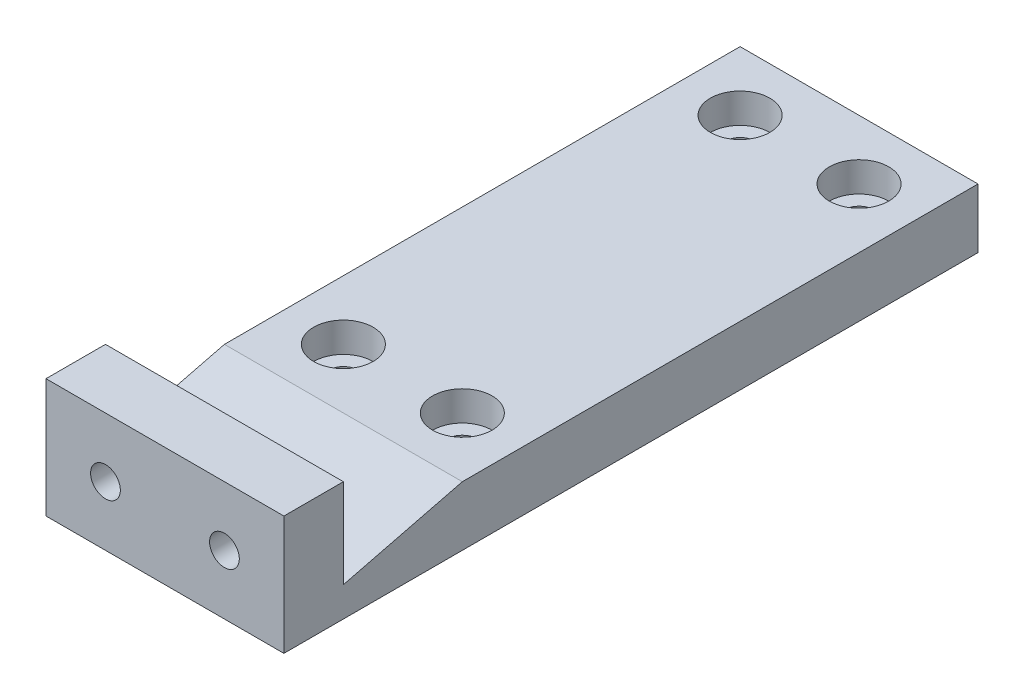
ISO-10303-21;
HEADER;
FILE_DESCRIPTION(('STEP AP214'),'2;1');
FILE_NAME('part.step','',(''),(''),'','','');
FILE_SCHEMA(('AUTOMOTIVE_DESIGN { 1 0 10303 214 1 1 1 1 }'));
ENDSEC;
DATA;
#1=APPLICATION_CONTEXT('core data for automotive mechanical design processes');
#2=APPLICATION_PROTOCOL_DEFINITION('international standard','automotive_design',2000,#1);
#3=PRODUCT_CONTEXT('',#1,'mechanical');
#4=PRODUCT('Part','Part','',(#3));
#5=PRODUCT_RELATED_PRODUCT_CATEGORY('part','',(#4));
#6=PRODUCT_DEFINITION_FORMATION('','',#4);
#7=PRODUCT_DEFINITION_CONTEXT('part definition',#1,'design');
#8=PRODUCT_DEFINITION('design','',#6,#7);
#9=PRODUCT_DEFINITION_SHAPE('','',#8);
#10=(LENGTH_UNIT() NAMED_UNIT(*) SI_UNIT(.MILLI.,.METRE.));
#11=(NAMED_UNIT(*) PLANE_ANGLE_UNIT() SI_UNIT($,.RADIAN.));
#12=(NAMED_UNIT(*) SI_UNIT($,.STERADIAN.) SOLID_ANGLE_UNIT());
#13=UNCERTAINTY_MEASURE_WITH_UNIT(LENGTH_MEASURE(1.E-05),#10,'distance_accuracy_value','');
#14=(GEOMETRIC_REPRESENTATION_CONTEXT(3) GLOBAL_UNCERTAINTY_ASSIGNED_CONTEXT((#13)) GLOBAL_UNIT_ASSIGNED_CONTEXT((#10,
#11,#12)) REPRESENTATION_CONTEXT('',''));
#15=CARTESIAN_POINT('',(0.,0.,0.));
#16=DIRECTION('',(0.,0.,1.));
#17=DIRECTION('',(1.,0.,0.));
#18=AXIS2_PLACEMENT_3D('',#15,#16,#17);
#19=CARTESIAN_POINT('',(-10.,10.,58.35));
#20=DIRECTION('',(0.,0.,-1.));
#21=DIRECTION('',(-1.,0.,0.));
#22=AXIS2_PLACEMENT_3D('',#19,#20,#21);
#23=CYLINDRICAL_SURFACE('',#22,2.5);
#24=CARTESIAN_POINT('',(-10.,10.,58.35));
#25=DIRECTION('',(0.,0.,-1.));
#26=DIRECTION('',(-1.,0.,0.));
#27=AXIS2_PLACEMENT_3D('',#24,#25,#26);
#28=CIRCLE('',#27,2.5);
#29=CARTESIAN_POINT('',(-12.5,10.,58.35));
#30=VERTEX_POINT('',#29);
#31=EDGE_CURVE('E201',#30,#30,#28,.T.);
#32=ORIENTED_EDGE('',*,*,#31,.F.);
#33=EDGE_LOOP('',(#32));
#34=FACE_BOUND('',#33,.T.);
#35=CARTESIAN_POINT('',(-10.,10.,53.35));
#36=DIRECTION('',(0.,0.,-1.));
#37=DIRECTION('',(-1.,0.,0.));
#38=AXIS2_PLACEMENT_3D('',#35,#36,#37);
#39=CIRCLE('',#38,2.5);
#40=CARTESIAN_POINT('',(-12.5,10.,53.35));
#41=VERTEX_POINT('',#40);
#42=EDGE_CURVE('E49',#41,#41,#39,.F.);
#43=ORIENTED_EDGE('',*,*,#42,.F.);
#44=EDGE_LOOP('',(#43));
#45=FACE_BOUND('',#44,.T.);
#46=ADVANCED_FACE('F45',(#34,#45),#23,.F.);
#47=CARTESIAN_POINT('',(10.,10.,58.35));
#48=DIRECTION('',(0.,0.,-1.));
#49=DIRECTION('',(-1.,0.,0.));
#50=AXIS2_PLACEMENT_3D('',#47,#48,#49);
#51=CYLINDRICAL_SURFACE('',#50,2.5);
#52=CARTESIAN_POINT('',(10.,10.,58.35));
#53=DIRECTION('',(0.,0.,-1.));
#54=DIRECTION('',(-1.,0.,0.));
#55=AXIS2_PLACEMENT_3D('',#52,#53,#54);
#56=CIRCLE('',#55,2.5);
#57=CARTESIAN_POINT('',(7.5,10.,58.35));
#58=VERTEX_POINT('',#57);
#59=EDGE_CURVE('E124',#58,#58,#56,.T.);
#60=ORIENTED_EDGE('',*,*,#59,.F.);
#61=EDGE_LOOP('',(#60));
#62=FACE_BOUND('',#61,.T.);
#63=CARTESIAN_POINT('',(10.,10.,53.35));
#64=DIRECTION('',(0.,0.,-1.));
#65=DIRECTION('',(-1.,0.,0.));
#66=AXIS2_PLACEMENT_3D('',#63,#64,#65);
#67=CIRCLE('',#66,2.5);
#68=CARTESIAN_POINT('',(7.5,10.,53.35));
#69=VERTEX_POINT('',#68);
#70=EDGE_CURVE('E192',#69,#69,#67,.F.);
#71=ORIENTED_EDGE('',*,*,#70,.F.);
#72=EDGE_LOOP('',(#71));
#73=FACE_BOUND('',#72,.T.);
#74=ADVANCED_FACE('F332',(#62,#73),#51,.F.);
#75=CARTESIAN_POINT('',(-10.,0.,-48.35));
#76=DIRECTION('',(0.,1.,0.));
#77=DIRECTION('',(0.,0.,1.));
#78=AXIS2_PLACEMENT_3D('',#75,#76,#77);
#79=CYLINDRICAL_SURFACE('',#78,2.5);
#80=CARTESIAN_POINT('',(-10.,0.,-48.35));
#81=DIRECTION('',(0.,1.,0.));
#82=DIRECTION('',(0.,0.,1.));
#83=AXIS2_PLACEMENT_3D('',#80,#81,#82);
#84=CIRCLE('',#83,2.5);
#85=CARTESIAN_POINT('',(-10.,0.,-45.85));
#86=VERTEX_POINT('',#85);
#87=EDGE_CURVE('E266',#86,#86,#84,.T.);
#88=ORIENTED_EDGE('',*,*,#87,.F.);
#89=EDGE_LOOP('',(#88));
#90=FACE_BOUND('',#89,.T.);
#91=CARTESIAN_POINT('',(-10.,5.,-48.35));
#92=DIRECTION('',(0.,1.,0.));
#93=DIRECTION('',(0.,0.,1.));
#94=AXIS2_PLACEMENT_3D('',#91,#92,#93);
#95=CIRCLE('',#94,2.5);
#96=CARTESIAN_POINT('',(-10.,5.,-45.85));
#97=VERTEX_POINT('',#96);
#98=EDGE_CURVE('E188',#97,#97,#95,.F.);
#99=ORIENTED_EDGE('',*,*,#98,.F.);
#100=EDGE_LOOP('',(#99));
#101=FACE_BOUND('',#100,.T.);
#102=ADVANCED_FACE('F338',(#90,#101),#79,.F.);
#103=CARTESIAN_POINT('',(10.,0.,-48.35));
#104=DIRECTION('',(0.,1.,0.));
#105=DIRECTION('',(0.,0.,1.));
#106=AXIS2_PLACEMENT_3D('',#103,#104,#105);
#107=CYLINDRICAL_SURFACE('',#106,2.5);
#108=CARTESIAN_POINT('',(10.,0.,-48.35));
#109=DIRECTION('',(0.,1.,0.));
#110=DIRECTION('',(0.,0.,1.));
#111=AXIS2_PLACEMENT_3D('',#108,#109,#110);
#112=CIRCLE('',#111,2.5);
#113=CARTESIAN_POINT('',(10.,0.,-45.85));
#114=VERTEX_POINT('',#113);
#115=EDGE_CURVE('E262',#114,#114,#112,.T.);
#116=ORIENTED_EDGE('',*,*,#115,.F.);
#117=EDGE_LOOP('',(#116));
#118=FACE_BOUND('',#117,.T.);
#119=CARTESIAN_POINT('',(10.,5.,-48.35));
#120=DIRECTION('',(0.,1.,0.));
#121=DIRECTION('',(0.,0.,1.));
#122=AXIS2_PLACEMENT_3D('',#119,#120,#121);
#123=CIRCLE('',#122,2.5);
#124=CARTESIAN_POINT('',(10.,5.,-45.85));
#125=VERTEX_POINT('',#124);
#126=EDGE_CURVE('E184',#125,#125,#123,.F.);
#127=ORIENTED_EDGE('',*,*,#126,.F.);
#128=EDGE_LOOP('',(#127));
#129=FACE_BOUND('',#128,.T.);
#130=ADVANCED_FACE('F379',(#118,#129),#107,.F.);
#131=CARTESIAN_POINT('',(10.,0.,18.35));
#132=DIRECTION('',(0.,1.,0.));
#133=DIRECTION('',(0.,0.,1.));
#134=AXIS2_PLACEMENT_3D('',#131,#132,#133);
#135=CYLINDRICAL_SURFACE('',#134,2.5);
#136=CARTESIAN_POINT('',(10.,0.,18.35));
#137=DIRECTION('',(0.,1.,0.));
#138=DIRECTION('',(0.,0.,1.));
#139=AXIS2_PLACEMENT_3D('',#136,#137,#138);
#140=CIRCLE('',#139,2.5);
#141=CARTESIAN_POINT('',(10.,0.,20.85));
#142=VERTEX_POINT('',#141);
#143=EDGE_CURVE('E267',#142,#142,#140,.T.);
#144=ORIENTED_EDGE('',*,*,#143,.F.);
#145=EDGE_LOOP('',(#144));
#146=FACE_BOUND('',#145,.T.);
#147=CARTESIAN_POINT('',(10.,5.,18.35));
#148=DIRECTION('',(0.,1.,0.));
#149=DIRECTION('',(0.,0.,1.));
#150=AXIS2_PLACEMENT_3D('',#147,#148,#149);
#151=CIRCLE('',#150,2.5);
#152=CARTESIAN_POINT('',(10.,5.,20.85));
#153=VERTEX_POINT('',#152);
#154=EDGE_CURVE('E179',#153,#153,#151,.F.);
#155=ORIENTED_EDGE('',*,*,#154,.F.);
#156=EDGE_LOOP('',(#155));
#157=FACE_BOUND('',#156,.T.);
#158=ADVANCED_FACE('F328',(#146,#157),#135,.F.);
#159=CARTESIAN_POINT('',(-10.,0.,18.35));
#160=DIRECTION('',(0.,1.,0.));
#161=DIRECTION('',(0.,0.,1.));
#162=AXIS2_PLACEMENT_3D('',#159,#160,#161);
#163=CYLINDRICAL_SURFACE('',#162,2.5);
#164=CARTESIAN_POINT('',(-10.,0.,18.35));
#165=DIRECTION('',(0.,1.,0.));
#166=DIRECTION('',(0.,0.,1.));
#167=AXIS2_PLACEMENT_3D('',#164,#165,#166);
#168=CIRCLE('',#167,2.5);
#169=CARTESIAN_POINT('',(-10.,0.,20.85));
#170=VERTEX_POINT('',#169);
#171=EDGE_CURVE('E191',#170,#170,#168,.T.);
#172=ORIENTED_EDGE('',*,*,#171,.F.);
#173=EDGE_LOOP('',(#172));
#174=FACE_BOUND('',#173,.T.);
#175=CARTESIAN_POINT('',(-10.,5.,18.35));
#176=DIRECTION('',(0.,1.,0.));
#177=DIRECTION('',(0.,0.,1.));
#178=AXIS2_PLACEMENT_3D('',#175,#176,#177);
#179=CIRCLE('',#178,2.5);
#180=CARTESIAN_POINT('',(-10.,5.,20.85));
#181=VERTEX_POINT('',#180);
#182=EDGE_CURVE('E175',#181,#181,#179,.F.);
#183=ORIENTED_EDGE('',*,*,#182,.F.);
#184=EDGE_LOOP('',(#183));
#185=FACE_BOUND('',#184,.T.);
#186=ADVANCED_FACE('F320',(#174,#185),#163,.F.);
#187=CARTESIAN_POINT('',(-20.,10.,58.35));
#188=DIRECTION('',(1.,0.,0.));
#189=DIRECTION('',(0.,0.,-1.));
#190=AXIS2_PLACEMENT_3D('',#187,#188,#189);
#191=PLANE('',#190);
#192=DIRECTION('',(0.,-1.,0.));
#193=VECTOR('',#192,1.);
#194=CARTESIAN_POINT('',(-20.,20.,48.35));
#195=LINE('',#194,#193);
#196=CARTESIAN_POINT('',(-20.,20.,48.35));
#197=VERTEX_POINT('',#196);
#198=CARTESIAN_POINT('',(-20.,5.,48.35));
#199=VERTEX_POINT('',#198);
#200=EDGE_CURVE('E291',#197,#199,#195,.T.);
#201=ORIENTED_EDGE('',*,*,#200,.T.);
#202=DIRECTION('',(0.,0.242535625036333,-0.970142500145332));
#203=VECTOR('',#202,1.);
#204=CARTESIAN_POINT('',(-20.,2.94117647058823,56.5852941176471));
#205=LINE('',#204,#203);
#206=CARTESIAN_POINT('',(-20.,10.,28.35));
#207=VERTEX_POINT('',#206);
#208=EDGE_CURVE('E222',#199,#207,#205,.T.);
#209=ORIENTED_EDGE('',*,*,#208,.T.);
#210=DIRECTION('',(0.,0.,1.));
#211=VECTOR('',#210,1.);
#212=CARTESIAN_POINT('',(-20.,10.,58.35));
#213=LINE('',#212,#211);
#214=CARTESIAN_POINT('',(-20.,10.,-58.35));
#215=VERTEX_POINT('',#214);
#216=EDGE_CURVE('E133',#215,#207,#213,.T.);
#217=ORIENTED_EDGE('',*,*,#216,.F.);
#218=DIRECTION('',(0.,-1.,0.));
#219=VECTOR('',#218,1.);
#220=CARTESIAN_POINT('',(-20.,10.,-58.35));
#221=LINE('',#220,#219);
#222=CARTESIAN_POINT('',(-20.,0.,-58.35));
#223=VERTEX_POINT('',#222);
#224=EDGE_CURVE('E146',#215,#223,#221,.T.);
#225=ORIENTED_EDGE('',*,*,#224,.T.);
#226=DIRECTION('',(0.,0.,1.));
#227=VECTOR('',#226,1.);
#228=CARTESIAN_POINT('',(-20.,0.,58.35));
#229=LINE('',#228,#227);
#230=CARTESIAN_POINT('',(-20.,0.,58.35));
#231=VERTEX_POINT('',#230);
#232=EDGE_CURVE('E154',#223,#231,#229,.T.);
#233=ORIENTED_EDGE('',*,*,#232,.T.);
#234=DIRECTION('',(0.,-1.,0.));
#235=VECTOR('',#234,1.);
#236=CARTESIAN_POINT('',(-20.,10.,58.35));
#237=LINE('',#236,#235);
#238=CARTESIAN_POINT('',(-20.,20.,58.35));
#239=VERTEX_POINT('',#238);
#240=EDGE_CURVE('E11',#239,#231,#237,.T.);
#241=ORIENTED_EDGE('',*,*,#240,.F.);
#242=DIRECTION('',(0.,0.,1.));
#243=VECTOR('',#242,1.);
#244=CARTESIAN_POINT('',(-20.,20.,48.35));
#245=LINE('',#244,#243);
#246=EDGE_CURVE('E277',#197,#239,#245,.T.);
#247=ORIENTED_EDGE('',*,*,#246,.F.);
#248=EDGE_LOOP('',(#201,#209,#217,#225,#233,#241,#247));
#249=FACE_BOUND('',#248,.T.);
#250=ADVANCED_FACE('F47',(#249),#191,.F.);
#251=CARTESIAN_POINT('',(20.,10.,58.35));
#252=DIRECTION('',(0.,0.,-1.));
#253=DIRECTION('',(-1.,0.,0.));
#254=AXIS2_PLACEMENT_3D('',#251,#252,#253);
#255=PLANE('',#254);
#256=ORIENTED_EDGE('',*,*,#59,.T.);
#257=EDGE_LOOP('',(#256));
#258=FACE_BOUND('',#257,.T.);
#259=ORIENTED_EDGE('',*,*,#31,.T.);
#260=EDGE_LOOP('',(#259));
#261=FACE_BOUND('',#260,.T.);
#262=DIRECTION('',(1.,0.,0.));
#263=VECTOR('',#262,1.);
#264=CARTESIAN_POINT('',(20.,0.,58.35));
#265=LINE('',#264,#263);
#266=CARTESIAN_POINT('',(20.,0.,58.35));
#267=VERTEX_POINT('',#266);
#268=EDGE_CURVE('E158',#231,#267,#265,.T.);
#269=ORIENTED_EDGE('',*,*,#268,.T.);
#270=DIRECTION('',(0.,-1.,0.));
#271=VECTOR('',#270,1.);
#272=CARTESIAN_POINT('',(20.,10.,58.35));
#273=LINE('',#272,#271);
#274=CARTESIAN_POINT('',(20.,20.,58.35));
#275=VERTEX_POINT('',#274);
#276=EDGE_CURVE('E55',#275,#267,#273,.T.);
#277=ORIENTED_EDGE('',*,*,#276,.F.);
#278=DIRECTION('',(1.,0.,0.));
#279=VECTOR('',#278,1.);
#280=CARTESIAN_POINT('',(-20.,20.,58.35));
#281=LINE('',#280,#279);
#282=EDGE_CURVE('E281',#239,#275,#281,.T.);
#283=ORIENTED_EDGE('',*,*,#282,.F.);
#284=ORIENTED_EDGE('',*,*,#240,.T.);
#285=EDGE_LOOP('',(#269,#277,#283,#284));
#286=FACE_BOUND('',#285,.T.);
#287=ADVANCED_FACE('F306',(#258,#261,#286),#255,.F.);
#288=CARTESIAN_POINT('',(20.,10.,58.35));
#289=DIRECTION('',(-1.,0.,0.));
#290=DIRECTION('',(0.,0.,1.));
#291=AXIS2_PLACEMENT_3D('',#288,#289,#290);
#292=PLANE('',#291);
#293=DIRECTION('',(0.,-0.242535625036333,0.970142500145332));
#294=VECTOR('',#293,1.);
#295=CARTESIAN_POINT('',(20.,10.,28.35));
#296=LINE('',#295,#294);
#297=CARTESIAN_POINT('',(20.,10.,28.35));
#298=VERTEX_POINT('',#297);
#299=CARTESIAN_POINT('',(20.,5.,48.35));
#300=VERTEX_POINT('',#299);
#301=EDGE_CURVE('E111',#298,#300,#296,.T.);
#302=ORIENTED_EDGE('',*,*,#301,.T.);
#303=DIRECTION('',(0.,-1.,0.));
#304=VECTOR('',#303,1.);
#305=CARTESIAN_POINT('',(20.,20.,48.35));
#306=LINE('',#305,#304);
#307=CARTESIAN_POINT('',(20.,20.,48.35));
#308=VERTEX_POINT('',#307);
#309=EDGE_CURVE('E159',#308,#300,#306,.T.);
#310=ORIENTED_EDGE('',*,*,#309,.F.);
#311=DIRECTION('',(0.,0.,-1.));
#312=VECTOR('',#311,1.);
#313=CARTESIAN_POINT('',(20.,20.,48.35));
#314=LINE('',#313,#312);
#315=EDGE_CURVE('E285',#275,#308,#314,.T.);
#316=ORIENTED_EDGE('',*,*,#315,.F.);
#317=ORIENTED_EDGE('',*,*,#276,.T.);
#318=DIRECTION('',(0.,0.,-1.));
#319=VECTOR('',#318,1.);
#320=CARTESIAN_POINT('',(20.,0.,58.35));
#321=LINE('',#320,#319);
#322=CARTESIAN_POINT('',(20.,0.,-58.35));
#323=VERTEX_POINT('',#322);
#324=EDGE_CURVE('E162',#267,#323,#321,.T.);
#325=ORIENTED_EDGE('',*,*,#324,.T.);
#326=DIRECTION('',(0.,-1.,0.));
#327=VECTOR('',#326,1.);
#328=CARTESIAN_POINT('',(20.,10.,-58.35));
#329=LINE('',#328,#327);
#330=CARTESIAN_POINT('',(20.,10.,-58.35));
#331=VERTEX_POINT('',#330);
#332=EDGE_CURVE('E139',#331,#323,#329,.T.);
#333=ORIENTED_EDGE('',*,*,#332,.F.);
#334=DIRECTION('',(0.,0.,-1.));
#335=VECTOR('',#334,1.);
#336=CARTESIAN_POINT('',(20.,10.,58.35));
#337=LINE('',#336,#335);
#338=EDGE_CURVE('E130',#298,#331,#337,.T.);
#339=ORIENTED_EDGE('',*,*,#338,.F.);
#340=EDGE_LOOP('',(#302,#310,#316,#317,#325,#333,#339));
#341=FACE_BOUND('',#340,.T.);
#342=ADVANCED_FACE('F137',(#341),#292,.F.);
#343=CARTESIAN_POINT('',(20.,10.,-58.35));
#344=DIRECTION('',(0.,0.,1.));
#345=DIRECTION('',(1.,0.,0.));
#346=AXIS2_PLACEMENT_3D('',#343,#344,#345);
#347=PLANE('',#346);
#348=DIRECTION('',(-1.,0.,0.));
#349=VECTOR('',#348,1.);
#350=CARTESIAN_POINT('',(20.,0.,-58.35));
#351=LINE('',#350,#349);
#352=EDGE_CURVE('E148',#323,#223,#351,.T.);
#353=ORIENTED_EDGE('',*,*,#352,.T.);
#354=ORIENTED_EDGE('',*,*,#224,.F.);
#355=DIRECTION('',(-1.,0.,0.));
#356=VECTOR('',#355,1.);
#357=CARTESIAN_POINT('',(20.,10.,-58.35));
#358=LINE('',#357,#356);
#359=EDGE_CURVE('E142',#331,#215,#358,.T.);
#360=ORIENTED_EDGE('',*,*,#359,.F.);
#361=ORIENTED_EDGE('',*,*,#332,.T.);
#362=EDGE_LOOP('',(#353,#354,#360,#361));
#363=FACE_BOUND('',#362,.T.);
#364=ADVANCED_FACE('F312',(#363),#347,.F.);
#365=CARTESIAN_POINT('',(0.,10.,0.));
#366=DIRECTION('',(0.,1.,0.));
#367=DIRECTION('',(0.,0.,1.));
#368=AXIS2_PLACEMENT_3D('',#365,#366,#367);
#369=PLANE('',#368);
#370=DIRECTION('',(-1.,0.,0.));
#371=VECTOR('',#370,1.);
#372=CARTESIAN_POINT('',(20.,10.,28.35));
#373=LINE('',#372,#371);
#374=EDGE_CURVE('E115',#298,#207,#373,.T.);
#375=ORIENTED_EDGE('',*,*,#374,.F.);
#376=ORIENTED_EDGE('',*,*,#338,.T.);
#377=ORIENTED_EDGE('',*,*,#359,.T.);
#378=ORIENTED_EDGE('',*,*,#216,.T.);
#379=EDGE_LOOP('',(#375,#376,#377,#378));
#380=FACE_BOUND('',#379,.T.);
#381=CARTESIAN_POINT('',(-10.,10.,-48.35));
#382=DIRECTION('',(0.,1.,0.));
#383=DIRECTION('',(0.,0.,1.));
#384=AXIS2_PLACEMENT_3D('',#381,#382,#383);
#385=CIRCLE('',#384,5.);
#386=CARTESIAN_POINT('',(-10.,10.,-43.35));
#387=VERTEX_POINT('',#386);
#388=EDGE_CURVE('E240',#387,#387,#385,.T.);
#389=ORIENTED_EDGE('',*,*,#388,.F.);
#390=EDGE_LOOP('',(#389));
#391=FACE_BOUND('',#390,.T.);
#392=CARTESIAN_POINT('',(10.,10.,18.35));
#393=DIRECTION('',(0.,1.,0.));
#394=DIRECTION('',(0.,0.,1.));
#395=AXIS2_PLACEMENT_3D('',#392,#393,#394);
#396=CIRCLE('',#395,5.);
#397=CARTESIAN_POINT('',(10.,10.,23.35));
#398=VERTEX_POINT('',#397);
#399=EDGE_CURVE('E249',#398,#398,#396,.T.);
#400=ORIENTED_EDGE('',*,*,#399,.F.);
#401=EDGE_LOOP('',(#400));
#402=FACE_BOUND('',#401,.T.);
#403=CARTESIAN_POINT('',(-10.,10.,18.35));
#404=DIRECTION('',(0.,1.,0.));
#405=DIRECTION('',(0.,0.,1.));
#406=AXIS2_PLACEMENT_3D('',#403,#404,#405);
#407=CIRCLE('',#406,5.);
#408=CARTESIAN_POINT('',(-10.,10.,23.35));
#409=VERTEX_POINT('',#408);
#410=EDGE_CURVE('E232',#409,#409,#407,.T.);
#411=ORIENTED_EDGE('',*,*,#410,.F.);
#412=EDGE_LOOP('',(#411));
#413=FACE_BOUND('',#412,.T.);
#414=CARTESIAN_POINT('',(10.,10.,-48.35));
#415=DIRECTION('',(0.,1.,0.));
#416=DIRECTION('',(0.,0.,1.));
#417=AXIS2_PLACEMENT_3D('',#414,#415,#416);
#418=CIRCLE('',#417,5.);
#419=CARTESIAN_POINT('',(10.,10.,-43.35));
#420=VERTEX_POINT('',#419);
#421=EDGE_CURVE('E244',#420,#420,#418,.T.);
#422=ORIENTED_EDGE('',*,*,#421,.F.);
#423=EDGE_LOOP('',(#422));
#424=FACE_BOUND('',#423,.T.);
#425=ADVANCED_FACE('F128',(#380,#391,#402,#413,#424),#369,.T.);
#426=CARTESIAN_POINT('',(0.,0.,0.));
#427=DIRECTION('',(0.,1.,0.));
#428=DIRECTION('',(0.,0.,1.));
#429=AXIS2_PLACEMENT_3D('',#426,#427,#428);
#430=PLANE('',#429);
#431=ORIENTED_EDGE('',*,*,#171,.T.);
#432=EDGE_LOOP('',(#431));
#433=FACE_BOUND('',#432,.T.);
#434=ORIENTED_EDGE('',*,*,#143,.T.);
#435=EDGE_LOOP('',(#434));
#436=FACE_BOUND('',#435,.T.);
#437=ORIENTED_EDGE('',*,*,#115,.T.);
#438=EDGE_LOOP('',(#437));
#439=FACE_BOUND('',#438,.T.);
#440=ORIENTED_EDGE('',*,*,#87,.T.);
#441=EDGE_LOOP('',(#440));
#442=FACE_BOUND('',#441,.T.);
#443=ORIENTED_EDGE('',*,*,#232,.F.);
#444=ORIENTED_EDGE('',*,*,#352,.F.);
#445=ORIENTED_EDGE('',*,*,#324,.F.);
#446=ORIENTED_EDGE('',*,*,#268,.F.);
#447=EDGE_LOOP('',(#443,#444,#445,#446));
#448=FACE_BOUND('',#447,.T.);
#449=ADVANCED_FACE('F309',(#433,#436,#439,#442,#448),#430,.F.);
#450=CARTESIAN_POINT('',(-20.,20.,48.35));
#451=DIRECTION('',(0.,0.,1.));
#452=DIRECTION('',(1.,0.,0.));
#453=AXIS2_PLACEMENT_3D('',#450,#451,#452);
#454=PLANE('',#453);
#455=DIRECTION('',(-1.,0.,0.));
#456=VECTOR('',#455,1.);
#457=CARTESIAN_POINT('',(20.,5.,48.35));
#458=LINE('',#457,#456);
#459=CARTESIAN_POINT('',(10.,5.,48.35));
#460=VERTEX_POINT('',#459);
#461=EDGE_CURVE('E119',#300,#460,#458,.T.);
#462=ORIENTED_EDGE('',*,*,#461,.T.);
#463=CARTESIAN_POINT('',(10.,10.,48.35));
#464=DIRECTION('',(0.,0.,-1.));
#465=DIRECTION('',(-1.,0.,0.));
#466=AXIS2_PLACEMENT_3D('',#463,#464,#465);
#467=CIRCLE('',#466,5.);
#468=EDGE_CURVE('E66',#460,#460,#467,.T.);
#469=ORIENTED_EDGE('',*,*,#468,.F.);
#470=CARTESIAN_POINT('',(-10.,5.,48.35));
#471=VERTEX_POINT('',#470);
#472=EDGE_CURVE('E223',#460,#471,#458,.T.);
#473=ORIENTED_EDGE('',*,*,#472,.T.);
#474=CARTESIAN_POINT('',(-10.,10.,48.35));
#475=DIRECTION('',(0.,0.,-1.));
#476=DIRECTION('',(-1.,0.,0.));
#477=AXIS2_PLACEMENT_3D('',#474,#475,#476);
#478=CIRCLE('',#477,5.);
#479=EDGE_CURVE('E61',#471,#471,#478,.T.);
#480=ORIENTED_EDGE('',*,*,#479,.F.);
#481=EDGE_CURVE('E135',#471,#199,#458,.T.);
#482=ORIENTED_EDGE('',*,*,#481,.T.);
#483=ORIENTED_EDGE('',*,*,#200,.F.);
#484=DIRECTION('',(-1.,0.,0.));
#485=VECTOR('',#484,1.);
#486=CARTESIAN_POINT('',(-20.,20.,48.35));
#487=LINE('',#486,#485);
#488=EDGE_CURVE('E288',#308,#197,#487,.T.);
#489=ORIENTED_EDGE('',*,*,#488,.F.);
#490=ORIENTED_EDGE('',*,*,#309,.T.);
#491=EDGE_LOOP('',(#462,#469,#473,#480,#482,#483,#489,#490));
#492=FACE_BOUND('',#491,.T.);
#493=ADVANCED_FACE('F297',(#492),#454,.F.);
#494=CARTESIAN_POINT('',(0.,20.,0.));
#495=DIRECTION('',(0.,1.,0.));
#496=DIRECTION('',(0.,0.,1.));
#497=AXIS2_PLACEMENT_3D('',#494,#495,#496);
#498=PLANE('',#497);
#499=ORIENTED_EDGE('',*,*,#246,.T.);
#500=ORIENTED_EDGE('',*,*,#282,.T.);
#501=ORIENTED_EDGE('',*,*,#315,.T.);
#502=ORIENTED_EDGE('',*,*,#488,.T.);
#503=EDGE_LOOP('',(#499,#500,#501,#502));
#504=FACE_BOUND('',#503,.T.);
#505=ADVANCED_FACE('F302',(#504),#498,.T.);
#506=CARTESIAN_POINT('',(-10.,5.,18.35));
#507=DIRECTION('',(0.,1.,0.));
#508=DIRECTION('',(0.,0.,1.));
#509=AXIS2_PLACEMENT_3D('',#506,#507,#508);
#510=PLANE('',#509);
#511=CARTESIAN_POINT('',(-10.,5.,18.35));
#512=DIRECTION('',(0.,1.,0.));
#513=DIRECTION('',(0.,0.,1.));
#514=AXIS2_PLACEMENT_3D('',#511,#512,#513);
#515=CIRCLE('',#514,5.);
#516=CARTESIAN_POINT('',(-10.,5.,23.35));
#517=VERTEX_POINT('',#516);
#518=EDGE_CURVE('E229',#517,#517,#515,.T.);
#519=ORIENTED_EDGE('',*,*,#518,.T.);
#520=EDGE_LOOP('',(#519));
#521=FACE_BOUND('',#520,.T.);
#522=ORIENTED_EDGE('',*,*,#182,.T.);
#523=EDGE_LOOP('',(#522));
#524=FACE_BOUND('',#523,.T.);
#525=ADVANCED_FACE('F353',(#521,#524),#510,.T.);
#526=CARTESIAN_POINT('',(-10.,5.,18.35));
#527=DIRECTION('',(0.,1.,0.));
#528=DIRECTION('',(0.,0.,1.));
#529=AXIS2_PLACEMENT_3D('',#526,#527,#528);
#530=CYLINDRICAL_SURFACE('',#529,5.);
#531=ORIENTED_EDGE('',*,*,#518,.F.);
#532=EDGE_LOOP('',(#531));
#533=FACE_BOUND('',#532,.T.);
#534=ORIENTED_EDGE('',*,*,#410,.T.);
#535=EDGE_LOOP('',(#534));
#536=FACE_BOUND('',#535,.T.);
#537=ADVANCED_FACE('F349',(#533,#536),#530,.F.);
#538=CARTESIAN_POINT('',(10.,5.,18.35));
#539=DIRECTION('',(0.,1.,0.));
#540=DIRECTION('',(0.,0.,1.));
#541=AXIS2_PLACEMENT_3D('',#538,#539,#540);
#542=PLANE('',#541);
#543=CARTESIAN_POINT('',(10.,5.,18.35));
#544=DIRECTION('',(0.,1.,0.));
#545=DIRECTION('',(0.,0.,1.));
#546=AXIS2_PLACEMENT_3D('',#543,#544,#545);
#547=CIRCLE('',#546,5.);
#548=CARTESIAN_POINT('',(10.,5.,23.35));
#549=VERTEX_POINT('',#548);
#550=EDGE_CURVE('E236',#549,#549,#547,.T.);
#551=ORIENTED_EDGE('',*,*,#550,.T.);
#552=EDGE_LOOP('',(#551));
#553=FACE_BOUND('',#552,.T.);
#554=ORIENTED_EDGE('',*,*,#154,.T.);
#555=EDGE_LOOP('',(#554));
#556=FACE_BOUND('',#555,.T.);
#557=ADVANCED_FACE('F352',(#553,#556),#542,.T.);
#558=CARTESIAN_POINT('',(10.,5.,18.35));
#559=DIRECTION('',(0.,1.,0.));
#560=DIRECTION('',(0.,0.,1.));
#561=AXIS2_PLACEMENT_3D('',#558,#559,#560);
#562=CYLINDRICAL_SURFACE('',#561,5.);
#563=ORIENTED_EDGE('',*,*,#550,.F.);
#564=EDGE_LOOP('',(#563));
#565=FACE_BOUND('',#564,.T.);
#566=ORIENTED_EDGE('',*,*,#399,.T.);
#567=EDGE_LOOP('',(#566));
#568=FACE_BOUND('',#567,.T.);
#569=ADVANCED_FACE('F365',(#565,#568),#562,.F.);
#570=CARTESIAN_POINT('',(10.,5.,-48.35));
#571=DIRECTION('',(0.,1.,0.));
#572=DIRECTION('',(0.,0.,1.));
#573=AXIS2_PLACEMENT_3D('',#570,#571,#572);
#574=PLANE('',#573);
#575=CARTESIAN_POINT('',(10.,5.,-48.35));
#576=DIRECTION('',(0.,1.,0.));
#577=DIRECTION('',(0.,0.,1.));
#578=AXIS2_PLACEMENT_3D('',#575,#576,#577);
#579=CIRCLE('',#578,5.);
#580=CARTESIAN_POINT('',(10.,5.,-43.35));
#581=VERTEX_POINT('',#580);
#582=EDGE_CURVE('E180',#581,#581,#579,.T.);
#583=ORIENTED_EDGE('',*,*,#582,.T.);
#584=EDGE_LOOP('',(#583));
#585=FACE_BOUND('',#584,.T.);
#586=ORIENTED_EDGE('',*,*,#126,.T.);
#587=EDGE_LOOP('',(#586));
#588=FACE_BOUND('',#587,.T.);
#589=ADVANCED_FACE('F368',(#585,#588),#574,.T.);
#590=CARTESIAN_POINT('',(10.,5.,-48.35));
#591=DIRECTION('',(0.,1.,0.));
#592=DIRECTION('',(0.,0.,1.));
#593=AXIS2_PLACEMENT_3D('',#590,#591,#592);
#594=CYLINDRICAL_SURFACE('',#593,5.);
#595=ORIENTED_EDGE('',*,*,#582,.F.);
#596=EDGE_LOOP('',(#595));
#597=FACE_BOUND('',#596,.T.);
#598=ORIENTED_EDGE('',*,*,#421,.T.);
#599=EDGE_LOOP('',(#598));
#600=FACE_BOUND('',#599,.T.);
#601=ADVANCED_FACE('F363',(#597,#600),#594,.F.);
#602=CARTESIAN_POINT('',(-10.,5.,-48.35));
#603=DIRECTION('',(0.,1.,0.));
#604=DIRECTION('',(0.,0.,1.));
#605=AXIS2_PLACEMENT_3D('',#602,#603,#604);
#606=PLANE('',#605);
#607=CARTESIAN_POINT('',(-10.,5.,-48.35));
#608=DIRECTION('',(0.,1.,0.));
#609=DIRECTION('',(0.,0.,1.));
#610=AXIS2_PLACEMENT_3D('',#607,#608,#609);
#611=CIRCLE('',#610,5.);
#612=CARTESIAN_POINT('',(-10.,5.,-43.35));
#613=VERTEX_POINT('',#612);
#614=EDGE_CURVE('E245',#613,#613,#611,.T.);
#615=ORIENTED_EDGE('',*,*,#614,.T.);
#616=EDGE_LOOP('',(#615));
#617=FACE_BOUND('',#616,.T.);
#618=ORIENTED_EDGE('',*,*,#98,.T.);
#619=EDGE_LOOP('',(#618));
#620=FACE_BOUND('',#619,.T.);
#621=ADVANCED_FACE('F359',(#617,#620),#606,.T.);
#622=CARTESIAN_POINT('',(-10.,5.,-48.35));
#623=DIRECTION('',(0.,1.,0.));
#624=DIRECTION('',(0.,0.,1.));
#625=AXIS2_PLACEMENT_3D('',#622,#623,#624);
#626=CYLINDRICAL_SURFACE('',#625,5.);
#627=ORIENTED_EDGE('',*,*,#614,.F.);
#628=EDGE_LOOP('',(#627));
#629=FACE_BOUND('',#628,.T.);
#630=ORIENTED_EDGE('',*,*,#388,.T.);
#631=EDGE_LOOP('',(#630));
#632=FACE_BOUND('',#631,.T.);
#633=ADVANCED_FACE('F348',(#629,#632),#626,.F.);
#634=CARTESIAN_POINT('',(20.,10.,28.35));
#635=DIRECTION('',(0.,-0.970142500145332,-0.242535625036333));
#636=DIRECTION('',(0.,0.242535625036333,-0.970142500145332));
#637=AXIS2_PLACEMENT_3D('',#634,#635,#636);
#638=PLANE('',#637);
#639=ORIENTED_EDGE('',*,*,#461,.F.);
#640=ORIENTED_EDGE('',*,*,#301,.F.);
#641=ORIENTED_EDGE('',*,*,#374,.T.);
#642=ORIENTED_EDGE('',*,*,#208,.F.);
#643=ORIENTED_EDGE('',*,*,#481,.F.);
#644=ORIENTED_EDGE('',*,*,#472,.F.);
#645=EDGE_LOOP('',(#639,#640,#641,#642,#643,#644));
#646=FACE_BOUND('',#645,.T.);
#647=ADVANCED_FACE('F113',(#646),#638,.F.);
#648=CARTESIAN_POINT('',(10.,10.,53.35));
#649=DIRECTION('',(0.,0.,-1.));
#650=DIRECTION('',(-1.,0.,0.));
#651=AXIS2_PLACEMENT_3D('',#648,#649,#650);
#652=PLANE('',#651);
#653=CARTESIAN_POINT('',(10.,10.,53.35));
#654=DIRECTION('',(0.,0.,-1.));
#655=DIRECTION('',(-1.,0.,0.));
#656=AXIS2_PLACEMENT_3D('',#653,#654,#655);
#657=CIRCLE('',#656,5.);
#658=CARTESIAN_POINT('',(5.,10.,53.35));
#659=VERTEX_POINT('',#658);
#660=EDGE_CURVE('E195',#659,#659,#657,.T.);
#661=ORIENTED_EDGE('',*,*,#660,.T.);
#662=EDGE_LOOP('',(#661));
#663=FACE_BOUND('',#662,.T.);
#664=ORIENTED_EDGE('',*,*,#70,.T.);
#665=EDGE_LOOP('',(#664));
#666=FACE_BOUND('',#665,.T.);
#667=ADVANCED_FACE('F347',(#663,#666),#652,.T.);
#668=CARTESIAN_POINT('',(10.,10.,53.35));
#669=DIRECTION('',(0.,0.,-1.));
#670=DIRECTION('',(-1.,0.,0.));
#671=AXIS2_PLACEMENT_3D('',#668,#669,#670);
#672=CYLINDRICAL_SURFACE('',#671,5.);
#673=ORIENTED_EDGE('',*,*,#660,.F.);
#674=EDGE_LOOP('',(#673));
#675=FACE_BOUND('',#674,.T.);
#676=ORIENTED_EDGE('',*,*,#468,.T.);
#677=EDGE_LOOP('',(#676));
#678=FACE_BOUND('',#677,.T.);
#679=ADVANCED_FACE('F520',(#675,#678),#672,.F.);
#680=CARTESIAN_POINT('',(-10.,10.,53.35));
#681=DIRECTION('',(0.,0.,-1.));
#682=DIRECTION('',(-1.,0.,0.));
#683=AXIS2_PLACEMENT_3D('',#680,#681,#682);
#684=PLANE('',#683);
#685=CARTESIAN_POINT('',(-10.,10.,53.35));
#686=DIRECTION('',(0.,0.,-1.));
#687=DIRECTION('',(-1.,0.,0.));
#688=AXIS2_PLACEMENT_3D('',#685,#686,#687);
#689=CIRCLE('',#688,5.);
#690=CARTESIAN_POINT('',(-15.,10.,53.35));
#691=VERTEX_POINT('',#690);
#692=EDGE_CURVE('E211',#691,#691,#689,.T.);
#693=ORIENTED_EDGE('',*,*,#692,.T.);
#694=EDGE_LOOP('',(#693));
#695=FACE_BOUND('',#694,.T.);
#696=ORIENTED_EDGE('',*,*,#42,.T.);
#697=EDGE_LOOP('',(#696));
#698=FACE_BOUND('',#697,.T.);
#699=ADVANCED_FACE('F529',(#695,#698),#684,.T.);
#700=CARTESIAN_POINT('',(-10.,10.,53.35));
#701=DIRECTION('',(0.,0.,-1.));
#702=DIRECTION('',(-1.,0.,0.));
#703=AXIS2_PLACEMENT_3D('',#700,#701,#702);
#704=CYLINDRICAL_SURFACE('',#703,5.);
#705=ORIENTED_EDGE('',*,*,#692,.F.);
#706=EDGE_LOOP('',(#705));
#707=FACE_BOUND('',#706,.T.);
#708=ORIENTED_EDGE('',*,*,#479,.T.);
#709=EDGE_LOOP('',(#708));
#710=FACE_BOUND('',#709,.T.);
#711=ADVANCED_FACE('F539',(#707,#710),#704,.F.);
#712=CLOSED_SHELL('',(#46,#74,#102,#130,#158,#186,#250,#287,#342,#364,#425,#449,#493,#505,#525,
#537,#557,#569,#589,#601,#621,#633,#647,#667,#679,#699,#711));
#713=MANIFOLD_SOLID_BREP('B2',#712);
#714=ADVANCED_BREP_SHAPE_REPRESENTATION('',(#18,#713),#14);
#715=SHAPE_DEFINITION_REPRESENTATION(#9,#714);
ENDSEC;
END-ISO-10303-21;
